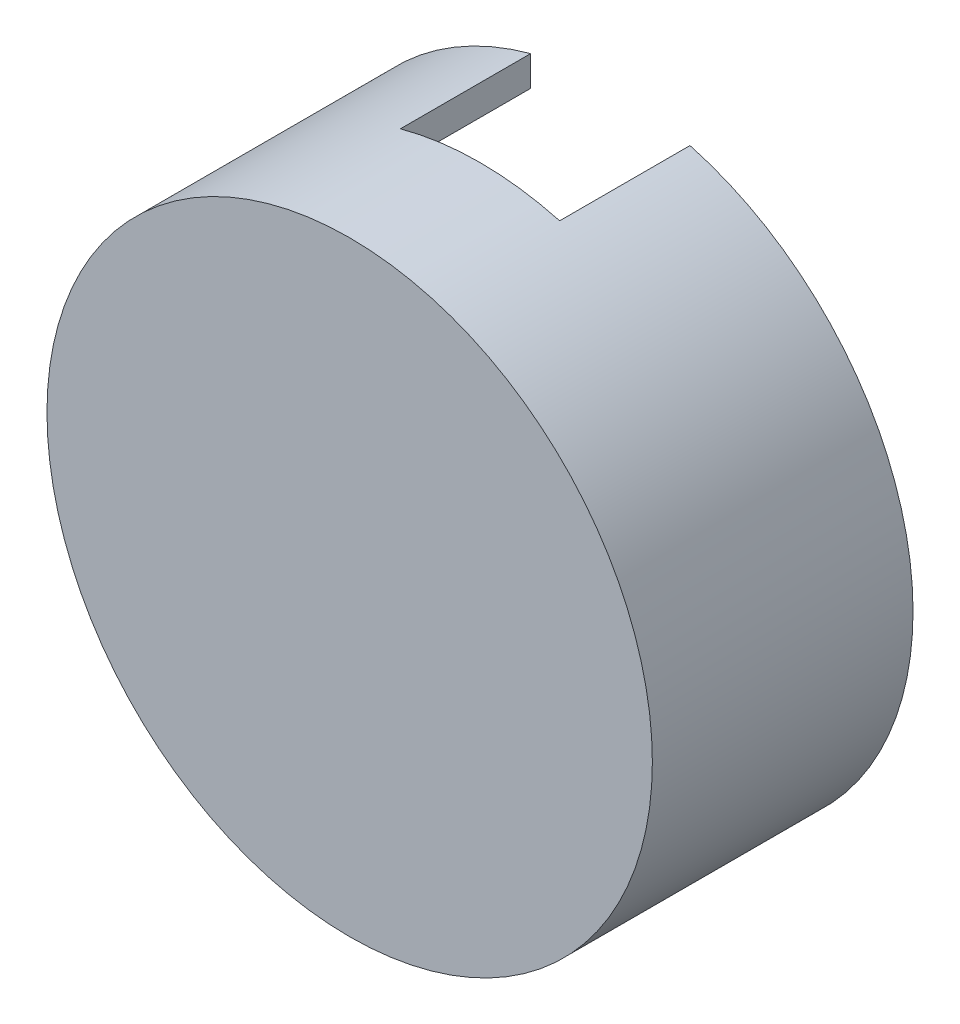
ISO-10303-21;
HEADER;
FILE_DESCRIPTION(('STEP AP214'),'2;1');
FILE_NAME('part.step','',(''),(''),'','','');
FILE_SCHEMA(('AUTOMOTIVE_DESIGN { 1 0 10303 214 1 1 1 1 }'));
ENDSEC;
DATA;
#1=APPLICATION_CONTEXT('core data for automotive mechanical design processes');
#2=APPLICATION_PROTOCOL_DEFINITION('international standard','automotive_design',2000,#1);
#3=PRODUCT_CONTEXT('',#1,'mechanical');
#4=PRODUCT('Part','Part','',(#3));
#5=PRODUCT_RELATED_PRODUCT_CATEGORY('part','',(#4));
#6=PRODUCT_DEFINITION_FORMATION('','',#4);
#7=PRODUCT_DEFINITION_CONTEXT('part definition',#1,'design');
#8=PRODUCT_DEFINITION('design','',#6,#7);
#9=PRODUCT_DEFINITION_SHAPE('','',#8);
#10=(LENGTH_UNIT() NAMED_UNIT(*) SI_UNIT(.MILLI.,.METRE.));
#11=(NAMED_UNIT(*) PLANE_ANGLE_UNIT() SI_UNIT($,.RADIAN.));
#12=(NAMED_UNIT(*) SI_UNIT($,.STERADIAN.) SOLID_ANGLE_UNIT());
#13=UNCERTAINTY_MEASURE_WITH_UNIT(LENGTH_MEASURE(1.E-05),#10,'distance_accuracy_value','');
#14=(GEOMETRIC_REPRESENTATION_CONTEXT(3) GLOBAL_UNCERTAINTY_ASSIGNED_CONTEXT((#13)) GLOBAL_UNIT_ASSIGNED_CONTEXT((#10,
#11,#12)) REPRESENTATION_CONTEXT('',''));
#15=CARTESIAN_POINT('',(0.,0.,0.));
#16=DIRECTION('',(0.,0.,1.));
#17=DIRECTION('',(1.,0.,0.));
#18=AXIS2_PLACEMENT_3D('',#15,#16,#17);
#19=CARTESIAN_POINT('',(-18.902,-1.25,0.));
#20=DIRECTION('',(0.,0.,-1.));
#21=DIRECTION('',(-1.,0.,0.));
#22=AXIS2_PLACEMENT_3D('',#19,#20,#21);
#23=PLANE('',#22);
#24=DIRECTION('',(1.,0.,0.));
#25=VECTOR('',#24,1.);
#26=CARTESIAN_POINT('',(-18.902,1.25,0.));
#27=LINE('',#26,#25);
#28=CARTESIAN_POINT('',(-18.8572224973755,1.25,0.));
#29=VERTEX_POINT('',#28);
#30=CARTESIAN_POINT('',(-16.402,1.25,0.));
#31=VERTEX_POINT('',#30);
#32=EDGE_CURVE('E62',#29,#31,#27,.T.);
#33=ORIENTED_EDGE('',*,*,#32,.T.);
#34=DIRECTION('',(0.,1.,0.));
#35=VECTOR('',#34,1.);
#36=CARTESIAN_POINT('',(-16.402,-1.25,0.));
#37=LINE('',#36,#35);
#38=CARTESIAN_POINT('',(-16.402,-1.25,0.));
#39=VERTEX_POINT('',#38);
#40=EDGE_CURVE('E55',#39,#31,#37,.T.);
#41=ORIENTED_EDGE('',*,*,#40,.F.);
#42=DIRECTION('',(1.,0.,0.));
#43=VECTOR('',#42,1.);
#44=CARTESIAN_POINT('',(-18.902,-1.25,0.));
#45=LINE('',#44,#43);
#46=CARTESIAN_POINT('',(-18.8572224973755,-1.25,0.));
#47=VERTEX_POINT('',#46);
#48=EDGE_CURVE('E128',#47,#39,#45,.T.);
#49=ORIENTED_EDGE('',*,*,#48,.F.);
#50=CARTESIAN_POINT('',(0.00340061004067214,0.,0.));
#51=DIRECTION('',(0.,0.,-1.));
#52=DIRECTION('',(-1.,0.,0.));
#53=AXIS2_PLACEMENT_3D('',#50,#51,#52);
#54=CIRCLE('',#53,18.902);
#55=EDGE_CURVE('E11',#29,#47,#54,.F.);
#56=ORIENTED_EDGE('',*,*,#55,.F.);
#57=EDGE_LOOP('',(#33,#41,#49,#56));
#58=FACE_BOUND('',#57,.T.);
#59=ADVANCED_FACE('F39',(#58),#23,.T.);
#60=CARTESIAN_POINT('',(-18.902,-1.25,2.03));
#61=DIRECTION('',(0.,-1.,0.));
#62=DIRECTION('',(0.,0.,-1.));
#63=AXIS2_PLACEMENT_3D('',#60,#61,#62);
#64=PLANE('',#63);
#65=ORIENTED_EDGE('',*,*,#48,.T.);
#66=DIRECTION('',(0.,0.,-1.));
#67=VECTOR('',#66,1.);
#68=CARTESIAN_POINT('',(-16.402,-1.25,2.03));
#69=LINE('',#68,#67);
#70=CARTESIAN_POINT('',(-16.402,-1.25,2.03));
#71=VERTEX_POINT('',#70);
#72=EDGE_CURVE('E119',#71,#39,#69,.T.);
#73=ORIENTED_EDGE('',*,*,#72,.F.);
#74=DIRECTION('',(1.,0.,0.));
#75=VECTOR('',#74,1.);
#76=CARTESIAN_POINT('',(-18.902,-1.25,2.03));
#77=LINE('',#76,#75);
#78=CARTESIAN_POINT('',(-18.8572224973755,-1.25,2.03));
#79=VERTEX_POINT('',#78);
#80=EDGE_CURVE('E117',#79,#71,#77,.T.);
#81=ORIENTED_EDGE('',*,*,#80,.F.);
#82=DIRECTION('',(0.,0.,-1.));
#83=VECTOR('',#82,1.);
#84=CARTESIAN_POINT('',(-18.8572224973755,-1.25,8.03484054713301));
#85=LINE('',#84,#83);
#86=EDGE_CURVE('E48',#47,#79,#85,.F.);
#87=ORIENTED_EDGE('',*,*,#86,.F.);
#88=EDGE_LOOP('',(#65,#73,#81,#87));
#89=FACE_BOUND('',#88,.T.);
#90=ADVANCED_FACE('F212',(#89),#64,.T.);
#91=CARTESIAN_POINT('',(-18.902,1.25,2.03));
#92=DIRECTION('',(0.,0.,1.));
#93=DIRECTION('',(1.,0.,0.));
#94=AXIS2_PLACEMENT_3D('',#91,#92,#93);
#95=PLANE('',#94);
#96=ORIENTED_EDGE('',*,*,#80,.T.);
#97=DIRECTION('',(0.,-1.,0.));
#98=VECTOR('',#97,1.);
#99=CARTESIAN_POINT('',(-16.402,1.25,2.03));
#100=LINE('',#99,#98);
#101=CARTESIAN_POINT('',(-16.402,1.25,2.03));
#102=VERTEX_POINT('',#101);
#103=EDGE_CURVE('E105',#102,#71,#100,.T.);
#104=ORIENTED_EDGE('',*,*,#103,.F.);
#105=DIRECTION('',(1.,0.,0.));
#106=VECTOR('',#105,1.);
#107=CARTESIAN_POINT('',(-18.902,1.25,2.03));
#108=LINE('',#107,#106);
#109=CARTESIAN_POINT('',(-18.8572224973755,1.25,2.03));
#110=VERTEX_POINT('',#109);
#111=EDGE_CURVE('E114',#110,#102,#108,.T.);
#112=ORIENTED_EDGE('',*,*,#111,.F.);
#113=CARTESIAN_POINT('',(0.00340061004067238,0.,2.03));
#114=DIRECTION('',(0.,0.,1.));
#115=DIRECTION('',(1.,0.,0.));
#116=AXIS2_PLACEMENT_3D('',#113,#114,#115);
#117=CIRCLE('',#116,18.902);
#118=EDGE_CURVE('E202',#79,#110,#117,.F.);
#119=ORIENTED_EDGE('',*,*,#118,.F.);
#120=EDGE_LOOP('',(#96,#104,#112,#119));
#121=FACE_BOUND('',#120,.T.);
#122=ADVANCED_FACE('F113',(#121),#95,.T.);
#123=CARTESIAN_POINT('',(-18.902,1.25,0.));
#124=DIRECTION('',(0.,1.,0.));
#125=DIRECTION('',(0.,0.,1.));
#126=AXIS2_PLACEMENT_3D('',#123,#124,#125);
#127=PLANE('',#126);
#128=ORIENTED_EDGE('',*,*,#111,.T.);
#129=DIRECTION('',(0.,0.,1.));
#130=VECTOR('',#129,1.);
#131=CARTESIAN_POINT('',(-16.402,1.25,0.));
#132=LINE('',#131,#130);
#133=EDGE_CURVE('E102',#31,#102,#132,.T.);
#134=ORIENTED_EDGE('',*,*,#133,.F.);
#135=ORIENTED_EDGE('',*,*,#32,.F.);
#136=DIRECTION('',(0.,0.,-1.));
#137=VECTOR('',#136,1.);
#138=CARTESIAN_POINT('',(-18.8572224973755,1.25,8.03484054713301));
#139=LINE('',#138,#137);
#140=EDGE_CURVE('E123',#110,#29,#139,.T.);
#141=ORIENTED_EDGE('',*,*,#140,.F.);
#142=EDGE_LOOP('',(#128,#134,#135,#141));
#143=FACE_BOUND('',#142,.T.);
#144=ADVANCED_FACE('F121',(#143),#127,.T.);
#145=CARTESIAN_POINT('',(0.00340061004067312,0.,8.034840547133));
#146=DIRECTION('',(0.,0.,-1.));
#147=DIRECTION('',(-1.,0.,0.));
#148=AXIS2_PLACEMENT_3D('',#145,#146,#147);
#149=CYLINDRICAL_SURFACE('',#148,20.902);
#150=CARTESIAN_POINT('',(0.00340061004067336,0.,10.034840547133));
#151=DIRECTION('',(0.,0.,-1.));
#152=DIRECTION('',(-1.,0.,0.));
#153=AXIS2_PLACEMENT_3D('',#150,#151,#152);
#154=CIRCLE('',#153,20.902);
#155=CARTESIAN_POINT('',(-20.8985993899593,0.,10.034840547133));
#156=VERTEX_POINT('',#155);
#157=EDGE_CURVE('E174',#156,#156,#154,.T.);
#158=ORIENTED_EDGE('',*,*,#157,.T.);
#159=EDGE_LOOP('',(#158));
#160=FACE_BOUND('',#159,.T.);
#161=DIRECTION('',(0.,0.,-1.));
#162=VECTOR('',#161,1.);
#163=CARTESIAN_POINT('',(-5.49659938995933,20.1654061203835,8.034840547133));
#164=LINE('',#163,#162);
#165=CARTESIAN_POINT('',(-5.49659938995933,20.1654061203835,-7.96515945286699));
#166=VERTEX_POINT('',#165);
#167=CARTESIAN_POINT('',(-5.49659938995933,20.1654061203835,1.03484054713301));
#168=VERTEX_POINT('',#167);
#169=EDGE_CURVE('E155',#166,#168,#164,.F.);
#170=ORIENTED_EDGE('',*,*,#169,.F.);
#171=CARTESIAN_POINT('',(0.00340061004067116,0.,-7.96515945286699));
#172=DIRECTION('',(0.,0.,-1.));
#173=DIRECTION('',(-1.,0.,0.));
#174=AXIS2_PLACEMENT_3D('',#171,#172,#173);
#175=CIRCLE('',#174,20.902);
#176=CARTESIAN_POINT('',(5.50340061004067,20.1654061203835,-7.96515945286699));
#177=VERTEX_POINT('',#176);
#178=EDGE_CURVE('E170',#177,#166,#175,.T.);
#179=ORIENTED_EDGE('',*,*,#178,.F.);
#180=DIRECTION('',(0.,0.,-1.));
#181=VECTOR('',#180,1.);
#182=CARTESIAN_POINT('',(5.50340061004067,20.1654061203835,8.034840547133));
#183=LINE('',#182,#181);
#184=CARTESIAN_POINT('',(5.50340061004067,20.1654061203835,1.03484054713301));
#185=VERTEX_POINT('',#184);
#186=EDGE_CURVE('E148',#177,#185,#183,.F.);
#187=ORIENTED_EDGE('',*,*,#186,.T.);
#188=CARTESIAN_POINT('',(0.00340061004067226,0.,1.03484054713301));
#189=DIRECTION('',(0.,0.,-1.));
#190=DIRECTION('',(-1.,0.,0.));
#191=AXIS2_PLACEMENT_3D('',#188,#189,#190);
#192=CIRCLE('',#191,20.902);
#193=EDGE_CURVE('E152',#168,#185,#192,.T.);
#194=ORIENTED_EDGE('',*,*,#193,.F.);
#195=EDGE_LOOP('',(#170,#179,#187,#194));
#196=FACE_BOUND('',#195,.T.);
#197=ADVANCED_FACE('F250',(#160,#196),#149,.T.);
#198=CARTESIAN_POINT('',(20.9054006100407,0.,-7.965159452867));
#199=DIRECTION('',(0.,0.,1.));
#200=DIRECTION('',(1.,0.,0.));
#201=AXIS2_PLACEMENT_3D('',#198,#199,#200);
#202=PLANE('',#201);
#203=DIRECTION('',(0.,-1.,0.));
#204=VECTOR('',#203,1.);
#205=CARTESIAN_POINT('',(-5.49659938995933,25.,-7.96515945286699));
#206=LINE('',#205,#204);
#207=CARTESIAN_POINT('',(-5.49659938995933,18.0841257460791,-7.965159452867));
#208=VERTEX_POINT('',#207);
#209=EDGE_CURVE('E133',#166,#208,#206,.T.);
#210=ORIENTED_EDGE('',*,*,#209,.T.);
#211=CARTESIAN_POINT('',(0.00340061004067116,0.,-7.96515945286699));
#212=DIRECTION('',(0.,0.,-1.));
#213=DIRECTION('',(-1.,0.,0.));
#214=AXIS2_PLACEMENT_3D('',#211,#212,#213);
#215=CIRCLE('',#214,18.902);
#216=CARTESIAN_POINT('',(5.50340061004067,18.0841257460791,-7.96515945286699));
#217=VERTEX_POINT('',#216);
#218=EDGE_CURVE('E166',#217,#208,#215,.T.);
#219=ORIENTED_EDGE('',*,*,#218,.F.);
#220=DIRECTION('',(0.,-1.,0.));
#221=VECTOR('',#220,1.);
#222=CARTESIAN_POINT('',(5.50340061004067,25.,-7.96515945286699));
#223=LINE('',#222,#221);
#224=EDGE_CURVE('E137',#177,#217,#223,.T.);
#225=ORIENTED_EDGE('',*,*,#224,.F.);
#226=ORIENTED_EDGE('',*,*,#178,.T.);
#227=EDGE_LOOP('',(#210,#219,#225,#226));
#228=FACE_BOUND('',#227,.T.);
#229=ADVANCED_FACE('F247',(#228),#202,.F.);
#230=CARTESIAN_POINT('',(0.00340061004067312,0.,8.034840547133));
#231=DIRECTION('',(0.,0.,-1.));
#232=DIRECTION('',(-1.,0.,0.));
#233=AXIS2_PLACEMENT_3D('',#230,#231,#232);
#234=CYLINDRICAL_SURFACE('',#233,18.902);
#235=ORIENTED_EDGE('',*,*,#140,.T.);
#236=ORIENTED_EDGE('',*,*,#55,.T.);
#237=ORIENTED_EDGE('',*,*,#86,.T.);
#238=ORIENTED_EDGE('',*,*,#118,.T.);
#239=EDGE_LOOP('',(#235,#236,#237,#238));
#240=FACE_BOUND('',#239,.T.);
#241=CARTESIAN_POINT('',(0.00340061004067238,0.,2.03484054713301));
#242=DIRECTION('',(0.,0.,-1.));
#243=DIRECTION('',(-1.,0.,0.));
#244=AXIS2_PLACEMENT_3D('',#241,#242,#243);
#245=CIRCLE('',#244,18.902);
#246=CARTESIAN_POINT('',(-18.8985993899593,0.,2.03484054713301));
#247=VERTEX_POINT('',#246);
#248=EDGE_CURVE('E162',#247,#247,#245,.T.);
#249=ORIENTED_EDGE('',*,*,#248,.F.);
#250=EDGE_LOOP('',(#249));
#251=FACE_BOUND('',#250,.T.);
#252=DIRECTION('',(0.,0.,-1.));
#253=VECTOR('',#252,1.);
#254=CARTESIAN_POINT('',(-5.49659938995933,18.0841257460791,8.034840547133));
#255=LINE('',#254,#253);
#256=CARTESIAN_POINT('',(-5.49659938995933,18.0841257460791,1.03484054713301));
#257=VERTEX_POINT('',#256);
#258=EDGE_CURVE('E197',#257,#208,#255,.T.);
#259=ORIENTED_EDGE('',*,*,#258,.F.);
#260=CARTESIAN_POINT('',(0.00340061004067226,0.,1.03484054713301));
#261=DIRECTION('',(0.,0.,-1.));
#262=DIRECTION('',(-1.,0.,0.));
#263=AXIS2_PLACEMENT_3D('',#260,#261,#262);
#264=CIRCLE('',#263,18.902);
#265=CARTESIAN_POINT('',(5.50340061004067,18.0841257460791,1.03484054713301));
#266=VERTEX_POINT('',#265);
#267=EDGE_CURVE('E194',#266,#257,#264,.F.);
#268=ORIENTED_EDGE('',*,*,#267,.F.);
#269=DIRECTION('',(0.,0.,-1.));
#270=VECTOR('',#269,1.);
#271=CARTESIAN_POINT('',(5.50340061004067,18.0841257460791,8.034840547133));
#272=LINE('',#271,#270);
#273=EDGE_CURVE('E190',#266,#217,#272,.T.);
#274=ORIENTED_EDGE('',*,*,#273,.T.);
#275=ORIENTED_EDGE('',*,*,#218,.T.);
#276=EDGE_LOOP('',(#259,#268,#274,#275));
#277=FACE_BOUND('',#276,.T.);
#278=ADVANCED_FACE('F207',(#240,#251,#277),#234,.F.);
#279=CARTESIAN_POINT('',(0.00340061004067312,0.,8.034840547133));
#280=DIRECTION('',(0.,0.,-1.));
#281=DIRECTION('',(-1.,0.,0.));
#282=AXIS2_PLACEMENT_3D('',#279,#280,#281);
#283=CYLINDRICAL_SURFACE('',#282,17.402);
#284=CARTESIAN_POINT('',(0.00340061004067263,0.,4.03484054713301));
#285=DIRECTION('',(0.,0.,-1.));
#286=DIRECTION('',(-1.,0.,0.));
#287=AXIS2_PLACEMENT_3D('',#284,#285,#286);
#288=CIRCLE('',#287,17.402);
#289=CARTESIAN_POINT('',(-17.3985993899593,0.,4.03484054713301));
#290=VERTEX_POINT('',#289);
#291=EDGE_CURVE('E186',#290,#290,#288,.T.);
#292=ORIENTED_EDGE('',*,*,#291,.F.);
#293=EDGE_LOOP('',(#292));
#294=FACE_BOUND('',#293,.T.);
#295=CARTESIAN_POINT('',(0.00340061004067238,0.,2.03484054713301));
#296=DIRECTION('',(0.,0.,-1.));
#297=DIRECTION('',(-1.,0.,0.));
#298=AXIS2_PLACEMENT_3D('',#295,#296,#297);
#299=CIRCLE('',#298,17.402);
#300=CARTESIAN_POINT('',(-17.3985993899593,0.,2.03484054713301));
#301=VERTEX_POINT('',#300);
#302=EDGE_CURVE('E158',#301,#301,#299,.T.);
#303=ORIENTED_EDGE('',*,*,#302,.T.);
#304=EDGE_LOOP('',(#303));
#305=FACE_BOUND('',#304,.T.);
#306=ADVANCED_FACE('F41',(#294,#305),#283,.F.);
#307=CARTESIAN_POINT('',(17.4054006100407,0.,4.034840547133));
#308=DIRECTION('',(0.,0.,-1.));
#309=DIRECTION('',(-1.,0.,0.));
#310=AXIS2_PLACEMENT_3D('',#307,#308,#309);
#311=PLANE('',#310);
#312=CARTESIAN_POINT('',(0.00340061004067263,0.,4.03484054713301));
#313=DIRECTION('',(0.,0.,-1.));
#314=DIRECTION('',(-1.,0.,0.));
#315=AXIS2_PLACEMENT_3D('',#312,#313,#314);
#316=CIRCLE('',#315,18.902);
#317=CARTESIAN_POINT('',(-18.8985993899593,0.,4.03484054713301));
#318=VERTEX_POINT('',#317);
#319=EDGE_CURVE('E182',#318,#318,#316,.T.);
#320=ORIENTED_EDGE('',*,*,#319,.F.);
#321=EDGE_LOOP('',(#320));
#322=FACE_BOUND('',#321,.T.);
#323=ORIENTED_EDGE('',*,*,#291,.T.);
#324=EDGE_LOOP('',(#323));
#325=FACE_BOUND('',#324,.T.);
#326=ADVANCED_FACE('F264',(#322,#325),#311,.F.);
#327=CARTESIAN_POINT('',(0.00340061004067312,0.,8.034840547133));
#328=DIRECTION('',(0.,0.,-1.));
#329=DIRECTION('',(-1.,0.,0.));
#330=AXIS2_PLACEMENT_3D('',#327,#328,#329);
#331=CYLINDRICAL_SURFACE('',#330,18.902);
#332=CARTESIAN_POINT('',(0.00340061004067312,0.,8.034840547133));
#333=DIRECTION('',(0.,0.,-1.));
#334=DIRECTION('',(-1.,0.,0.));
#335=AXIS2_PLACEMENT_3D('',#332,#333,#334);
#336=CIRCLE('',#335,18.902);
#337=CARTESIAN_POINT('',(-18.8985993899593,0.,8.03484054713301));
#338=VERTEX_POINT('',#337);
#339=EDGE_CURVE('E178',#338,#338,#336,.T.);
#340=ORIENTED_EDGE('',*,*,#339,.F.);
#341=EDGE_LOOP('',(#340));
#342=FACE_BOUND('',#341,.T.);
#343=ORIENTED_EDGE('',*,*,#319,.T.);
#344=EDGE_LOOP('',(#343));
#345=FACE_BOUND('',#344,.T.);
#346=ADVANCED_FACE('F261',(#342,#345),#331,.F.);
#347=CARTESIAN_POINT('',(0.00340061004067312,0.,8.034840547133));
#348=DIRECTION('',(0.,0.,1.));
#349=DIRECTION('',(1.,0.,0.));
#350=AXIS2_PLACEMENT_3D('',#347,#348,#349);
#351=PLANE('',#350);
#352=ORIENTED_EDGE('',*,*,#339,.T.);
#353=EDGE_LOOP('',(#352));
#354=FACE_BOUND('',#353,.T.);
#355=ADVANCED_FACE('F257',(#354),#351,.F.);
#356=CARTESIAN_POINT('',(0.00340061004067336,0.,10.034840547133));
#357=DIRECTION('',(0.,0.,-1.));
#358=DIRECTION('',(-1.,0.,0.));
#359=AXIS2_PLACEMENT_3D('',#356,#357,#358);
#360=PLANE('',#359);
#361=ORIENTED_EDGE('',*,*,#157,.F.);
#362=EDGE_LOOP('',(#361));
#363=FACE_BOUND('',#362,.T.);
#364=ADVANCED_FACE('F243',(#363),#360,.F.);
#365=CARTESIAN_POINT('',(18.9054006100407,0.,2.034840547133));
#366=DIRECTION('',(0.,0.,1.));
#367=DIRECTION('',(1.,0.,0.));
#368=AXIS2_PLACEMENT_3D('',#365,#366,#367);
#369=PLANE('',#368);
#370=ORIENTED_EDGE('',*,*,#302,.F.);
#371=EDGE_LOOP('',(#370));
#372=FACE_BOUND('',#371,.T.);
#373=ORIENTED_EDGE('',*,*,#248,.T.);
#374=EDGE_LOOP('',(#373));
#375=FACE_BOUND('',#374,.T.);
#376=ADVANCED_FACE('F239',(#372,#375),#369,.F.);
#377=CARTESIAN_POINT('',(-5.49659938995933,25.,-7.96515945286699));
#378=DIRECTION('',(1.,0.,0.));
#379=DIRECTION('',(0.,0.,-1.));
#380=AXIS2_PLACEMENT_3D('',#377,#378,#379);
#381=PLANE('',#380);
#382=ORIENTED_EDGE('',*,*,#169,.T.);
#383=DIRECTION('',(0.,-1.,0.));
#384=VECTOR('',#383,1.);
#385=CARTESIAN_POINT('',(-5.49659938995933,25.,1.03484054713301));
#386=LINE('',#385,#384);
#387=EDGE_CURVE('E144',#168,#257,#386,.T.);
#388=ORIENTED_EDGE('',*,*,#387,.T.);
#389=ORIENTED_EDGE('',*,*,#258,.T.);
#390=ORIENTED_EDGE('',*,*,#209,.F.);
#391=EDGE_LOOP('',(#382,#388,#389,#390));
#392=FACE_BOUND('',#391,.T.);
#393=ADVANCED_FACE('F235',(#392),#381,.T.);
#394=CARTESIAN_POINT('',(-5.49659938995933,25.,1.03484054713301));
#395=DIRECTION('',(0.,0.,-1.));
#396=DIRECTION('',(-1.,0.,0.));
#397=AXIS2_PLACEMENT_3D('',#394,#395,#396);
#398=PLANE('',#397);
#399=ORIENTED_EDGE('',*,*,#193,.T.);
#400=DIRECTION('',(0.,-1.,0.));
#401=VECTOR('',#400,1.);
#402=CARTESIAN_POINT('',(5.50340061004067,25.,1.03484054713301));
#403=LINE('',#402,#401);
#404=EDGE_CURVE('E140',#185,#266,#403,.T.);
#405=ORIENTED_EDGE('',*,*,#404,.T.);
#406=ORIENTED_EDGE('',*,*,#267,.T.);
#407=ORIENTED_EDGE('',*,*,#387,.F.);
#408=EDGE_LOOP('',(#399,#405,#406,#407));
#409=FACE_BOUND('',#408,.T.);
#410=ADVANCED_FACE('F231',(#409),#398,.T.);
#411=CARTESIAN_POINT('',(5.50340061004067,25.,-7.96515945286699));
#412=DIRECTION('',(1.,0.,0.));
#413=DIRECTION('',(0.,0.,-1.));
#414=AXIS2_PLACEMENT_3D('',#411,#412,#413);
#415=PLANE('',#414);
#416=ORIENTED_EDGE('',*,*,#224,.T.);
#417=ORIENTED_EDGE('',*,*,#273,.F.);
#418=ORIENTED_EDGE('',*,*,#404,.F.);
#419=ORIENTED_EDGE('',*,*,#186,.F.);
#420=EDGE_LOOP('',(#416,#417,#418,#419));
#421=FACE_BOUND('',#420,.T.);
#422=ADVANCED_FACE('F228',(#421),#415,.F.);
#423=CARTESIAN_POINT('',(-16.402,0.,0.));
#424=DIRECTION('',(1.,0.,0.));
#425=DIRECTION('',(0.,0.,-1.));
#426=AXIS2_PLACEMENT_3D('',#423,#424,#425);
#427=PLANE('',#426);
#428=ORIENTED_EDGE('',*,*,#40,.T.);
#429=ORIENTED_EDGE('',*,*,#133,.T.);
#430=ORIENTED_EDGE('',*,*,#103,.T.);
#431=ORIENTED_EDGE('',*,*,#72,.T.);
#432=EDGE_LOOP('',(#428,#429,#430,#431));
#433=FACE_BOUND('',#432,.T.);
#434=ADVANCED_FACE('F104',(#433),#427,.T.);
#435=CLOSED_SHELL('',(#59,#90,#122,#144,#197,#229,#278,#306,#326,#346,#355,#364,#376,#393,#410,
#422,#434));
#436=MANIFOLD_SOLID_BREP('B2',#435);
#437=ADVANCED_BREP_SHAPE_REPRESENTATION('',(#18,#436),#14);
#438=SHAPE_DEFINITION_REPRESENTATION(#9,#437);
ENDSEC;
END-ISO-10303-21;
